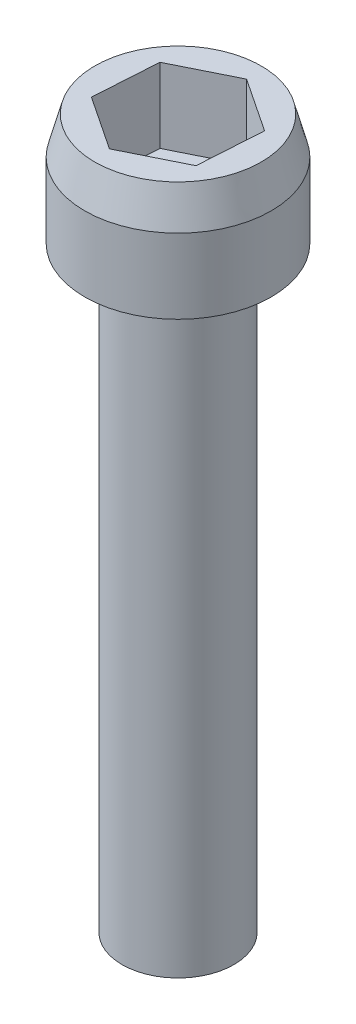
ISO-10303-21;
HEADER;
FILE_DESCRIPTION(('STEP AP214'),'2;1');
FILE_NAME('part.step','',(''),(''),'','','');
FILE_SCHEMA(('AUTOMOTIVE_DESIGN { 1 0 10303 214 1 1 1 1 }'));
ENDSEC;
DATA;
#1=APPLICATION_CONTEXT('core data for automotive mechanical design processes');
#2=APPLICATION_PROTOCOL_DEFINITION('international standard','automotive_design',2000,#1);
#3=PRODUCT_CONTEXT('',#1,'mechanical');
#4=PRODUCT('Part','Part','',(#3));
#5=PRODUCT_RELATED_PRODUCT_CATEGORY('part','',(#4));
#6=PRODUCT_DEFINITION_FORMATION('','',#4);
#7=PRODUCT_DEFINITION_CONTEXT('part definition',#1,'design');
#8=PRODUCT_DEFINITION('design','',#6,#7);
#9=PRODUCT_DEFINITION_SHAPE('','',#8);
#10=(LENGTH_UNIT() NAMED_UNIT(*) SI_UNIT(.MILLI.,.METRE.));
#11=(NAMED_UNIT(*) PLANE_ANGLE_UNIT() SI_UNIT($,.RADIAN.));
#12=(NAMED_UNIT(*) SI_UNIT($,.STERADIAN.) SOLID_ANGLE_UNIT());
#13=UNCERTAINTY_MEASURE_WITH_UNIT(LENGTH_MEASURE(1.E-05),#10,'distance_accuracy_value','');
#14=(GEOMETRIC_REPRESENTATION_CONTEXT(3) GLOBAL_UNCERTAINTY_ASSIGNED_CONTEXT((#13)) GLOBAL_UNIT_ASSIGNED_CONTEXT((#10,
#11,#12)) REPRESENTATION_CONTEXT('',''));
#15=CARTESIAN_POINT('',(0.,0.,0.));
#16=DIRECTION('',(0.,0.,1.));
#17=DIRECTION('',(1.,0.,0.));
#18=AXIS2_PLACEMENT_3D('',#15,#16,#17);
#19=CARTESIAN_POINT('',(0.,16.,0.));
#20=DIRECTION('',(0.,-1.,0.));
#21=DIRECTION('',(0.,0.,-1.));
#22=AXIS2_PLACEMENT_3D('',#19,#20,#21);
#23=CYLINDRICAL_SURFACE('',#22,1.5);
#24=CARTESIAN_POINT('',(0.,16.,0.));
#25=DIRECTION('',(0.,1.,0.));
#26=DIRECTION('',(0.,0.,1.));
#27=AXIS2_PLACEMENT_3D('',#24,#25,#26);
#28=CIRCLE('',#27,1.5);
#29=CARTESIAN_POINT('',(0.,16.,1.5));
#30=VERTEX_POINT('',#29);
#31=EDGE_CURVE('E143',#30,#30,#28,.T.);
#32=ORIENTED_EDGE('',*,*,#31,.F.);
#33=EDGE_LOOP('',(#32));
#34=FACE_BOUND('',#33,.T.);
#35=CARTESIAN_POINT('',(0.,0.,0.));
#36=DIRECTION('',(0.,1.,0.));
#37=DIRECTION('',(0.,0.,1.));
#38=AXIS2_PLACEMENT_3D('',#35,#36,#37);
#39=CIRCLE('',#38,1.5);
#40=CARTESIAN_POINT('',(0.,0.,1.5));
#41=VERTEX_POINT('',#40);
#42=EDGE_CURVE('E142',#41,#41,#39,.T.);
#43=ORIENTED_EDGE('',*,*,#42,.T.);
#44=EDGE_LOOP('',(#43));
#45=FACE_BOUND('',#44,.T.);
#46=ADVANCED_FACE('F32',(#34,#45),#23,.T.);
#47=CARTESIAN_POINT('',(0.,0.,0.));
#48=DIRECTION('',(0.,1.,0.));
#49=DIRECTION('',(0.,0.,1.));
#50=AXIS2_PLACEMENT_3D('',#47,#48,#49);
#51=PLANE('',#50);
#52=ORIENTED_EDGE('',*,*,#42,.F.);
#53=EDGE_LOOP('',(#52));
#54=FACE_BOUND('',#53,.T.);
#55=ADVANCED_FACE('F166',(#54),#51,.F.);
#56=CARTESIAN_POINT('',(0.,19.,0.));
#57=DIRECTION('',(0.,-1.,0.));
#58=DIRECTION('',(0.,0.,-1.));
#59=AXIS2_PLACEMENT_3D('',#56,#57,#58);
#60=CYLINDRICAL_SURFACE('',#59,2.5);
#61=CARTESIAN_POINT('',(0.,18.,0.));
#62=DIRECTION('',(0.,1.,0.));
#63=DIRECTION('',(0.,0.,1.));
#64=AXIS2_PLACEMENT_3D('',#61,#62,#63);
#65=CIRCLE('',#64,2.5);
#66=CARTESIAN_POINT('',(0.,18.,2.5));
#67=VERTEX_POINT('',#66);
#68=EDGE_CURVE('E11',#67,#67,#65,.F.);
#69=ORIENTED_EDGE('',*,*,#68,.T.);
#70=EDGE_LOOP('',(#69));
#71=FACE_BOUND('',#70,.T.);
#72=CARTESIAN_POINT('',(0.,16.,0.));
#73=DIRECTION('',(0.,1.,0.));
#74=DIRECTION('',(0.,0.,1.));
#75=AXIS2_PLACEMENT_3D('',#72,#73,#74);
#76=CIRCLE('',#75,2.5);
#77=CARTESIAN_POINT('',(0.,16.,2.5));
#78=VERTEX_POINT('',#77);
#79=EDGE_CURVE('E134',#78,#78,#76,.T.);
#80=ORIENTED_EDGE('',*,*,#79,.T.);
#81=EDGE_LOOP('',(#80));
#82=FACE_BOUND('',#81,.T.);
#83=ADVANCED_FACE('F171',(#71,#82),#60,.T.);
#84=CARTESIAN_POINT('',(0.,19.,0.));
#85=DIRECTION('',(0.,1.,0.));
#86=DIRECTION('',(0.,0.,1.));
#87=AXIS2_PLACEMENT_3D('',#84,#85,#86);
#88=PLANE('',#87);
#89=DIRECTION('',(0.832703024044809,0.,0.55371985132071));
#90=VECTOR('',#89,1.);
#91=CARTESIAN_POINT('',(-1.55172174961199,19.,0.769519078243736));
#92=LINE('',#91,#90);
#93=CARTESIAN_POINT('',(-1.55172174961199,19.,0.769519078243736));
#94=VERTEX_POINT('',#93);
#95=CARTESIAN_POINT('',(-0.109437804350137,19.,1.72858999389069));
#96=VERTEX_POINT('',#95);
#97=EDGE_CURVE('E47',#94,#96,#92,.T.);
#98=ORIENTED_EDGE('',*,*,#97,.F.);
#99=DIRECTION('',(-0.0631839458010727,0.,0.998001898291284));
#100=VECTOR('',#99,1.);
#101=CARTESIAN_POINT('',(-1.44228394526186,19.,-0.959070915646955));
#102=LINE('',#101,#100);
#103=CARTESIAN_POINT('',(-1.44228394526186,19.,-0.959070915646955));
#104=VERTEX_POINT('',#103);
#105=EDGE_CURVE('E130',#104,#94,#102,.T.);
#106=ORIENTED_EDGE('',*,*,#105,.F.);
#107=DIRECTION('',(-0.895886969845882,0.,0.444282046970574));
#108=VECTOR('',#107,1.);
#109=CARTESIAN_POINT('',(0.109437804350136,19.,-1.72858999389069));
#110=LINE('',#109,#108);
#111=CARTESIAN_POINT('',(0.109437804350136,19.,-1.72858999389069));
#112=VERTEX_POINT('',#111);
#113=EDGE_CURVE('E128',#112,#104,#110,.T.);
#114=ORIENTED_EDGE('',*,*,#113,.F.);
#115=DIRECTION('',(-0.83270302404481,0.,-0.55371985132071));
#116=VECTOR('',#115,1.);
#117=CARTESIAN_POINT('',(1.55172174961199,19.,-0.769519078243738));
#118=LINE('',#117,#116);
#119=CARTESIAN_POINT('',(1.55172174961199,19.,-0.769519078243738));
#120=VERTEX_POINT('',#119);
#121=EDGE_CURVE('E95',#120,#112,#118,.T.);
#122=ORIENTED_EDGE('',*,*,#121,.F.);
#123=DIRECTION('',(0.0631839458010727,0.,-0.998001898291284));
#124=VECTOR('',#123,1.);
#125=CARTESIAN_POINT('',(1.44228394526186,19.,0.959070915646955));
#126=LINE('',#125,#124);
#127=CARTESIAN_POINT('',(1.44228394526186,19.,0.959070915646955));
#128=VERTEX_POINT('',#127);
#129=EDGE_CURVE('E124',#128,#120,#126,.T.);
#130=ORIENTED_EDGE('',*,*,#129,.F.);
#131=DIRECTION('',(0.895886969845882,0.,-0.444282046970574));
#132=VECTOR('',#131,1.);
#133=CARTESIAN_POINT('',(-0.109437804350136,19.,1.72858999389069));
#134=LINE('',#133,#132);
#135=EDGE_CURVE('E121',#96,#128,#134,.T.);
#136=ORIENTED_EDGE('',*,*,#135,.F.);
#137=EDGE_LOOP('',(#98,#106,#114,#122,#130,#136));
#138=FACE_BOUND('',#137,.T.);
#139=CARTESIAN_POINT('',(0.,19.,0.));
#140=DIRECTION('',(0.,1.,0.));
#141=DIRECTION('',(0.,0.,1.));
#142=AXIS2_PLACEMENT_3D('',#139,#140,#141);
#143=CIRCLE('',#142,2.23205080756887);
#144=CARTESIAN_POINT('',(0.,19.,2.23205080756887));
#145=VERTEX_POINT('',#144);
#146=EDGE_CURVE('E40',#145,#145,#143,.T.);
#147=ORIENTED_EDGE('',*,*,#146,.T.);
#148=EDGE_LOOP('',(#147));
#149=FACE_BOUND('',#148,.T.);
#150=ADVANCED_FACE('F150',(#138,#149),#88,.T.);
#151=CARTESIAN_POINT('',(0.,16.,0.));
#152=DIRECTION('',(0.,1.,0.));
#153=DIRECTION('',(0.,0.,1.));
#154=AXIS2_PLACEMENT_3D('',#151,#152,#153);
#155=PLANE('',#154);
#156=ORIENTED_EDGE('',*,*,#31,.T.);
#157=EDGE_LOOP('',(#156));
#158=FACE_BOUND('',#157,.T.);
#159=ORIENTED_EDGE('',*,*,#79,.F.);
#160=EDGE_LOOP('',(#159));
#161=FACE_BOUND('',#160,.T.);
#162=ADVANCED_FACE('F154',(#158,#161),#155,.F.);
#163=CARTESIAN_POINT('',(0.,19.,0.));
#164=DIRECTION('',(0.,-1.,0.));
#165=DIRECTION('',(0.,0.,-1.));
#166=AXIS2_PLACEMENT_3D('',#163,#164,#165);
#167=CONICAL_SURFACE('',#166,2.23205080756887,0.261799387799149);
#168=ORIENTED_EDGE('',*,*,#68,.F.);
#169=EDGE_LOOP('',(#168));
#170=FACE_BOUND('',#169,.T.);
#171=ORIENTED_EDGE('',*,*,#146,.F.);
#172=EDGE_LOOP('',(#171));
#173=FACE_BOUND('',#172,.T.);
#174=ADVANCED_FACE('F34',(#170,#173),#167,.T.);
#175=CARTESIAN_POINT('',(-1.55172174961199,17.,0.769519078243736));
#176=DIRECTION('',(-0.55371985132071,0.,0.832703024044809));
#177=DIRECTION('',(0.832703024044809,0.,0.55371985132071));
#178=AXIS2_PLACEMENT_3D('',#175,#176,#177);
#179=PLANE('',#178);
#180=ORIENTED_EDGE('',*,*,#97,.T.);
#181=DIRECTION('',(0.,1.,0.));
#182=VECTOR('',#181,1.);
#183=CARTESIAN_POINT('',(-0.109437804350136,17.,1.72858999389069));
#184=LINE('',#183,#182);
#185=CARTESIAN_POINT('',(-0.109437804350136,17.,1.72858999389069));
#186=VERTEX_POINT('',#185);
#187=EDGE_CURVE('E77',#186,#96,#184,.T.);
#188=ORIENTED_EDGE('',*,*,#187,.F.);
#189=DIRECTION('',(0.832703024044809,0.,0.55371985132071));
#190=VECTOR('',#189,1.);
#191=CARTESIAN_POINT('',(-1.55172174961199,17.,0.769519078243736));
#192=LINE('',#191,#190);
#193=CARTESIAN_POINT('',(-1.55172174961199,17.,0.769519078243736));
#194=VERTEX_POINT('',#193);
#195=EDGE_CURVE('E132',#194,#186,#192,.T.);
#196=ORIENTED_EDGE('',*,*,#195,.F.);
#197=DIRECTION('',(0.,1.,0.));
#198=VECTOR('',#197,1.);
#199=CARTESIAN_POINT('',(-1.55172174961199,17.,0.769519078243736));
#200=LINE('',#199,#198);
#201=EDGE_CURVE('E55',#194,#94,#200,.T.);
#202=ORIENTED_EDGE('',*,*,#201,.T.);
#203=EDGE_LOOP('',(#180,#188,#196,#202));
#204=FACE_BOUND('',#203,.T.);
#205=ADVANCED_FACE('F153',(#204),#179,.F.);
#206=CARTESIAN_POINT('',(-1.44228394526186,17.,-0.959070915646955));
#207=DIRECTION('',(-0.998001898291284,0.,-0.0631839458010727));
#208=DIRECTION('',(-0.0631839458010727,0.,0.998001898291284));
#209=AXIS2_PLACEMENT_3D('',#206,#207,#208);
#210=PLANE('',#209);
#211=ORIENTED_EDGE('',*,*,#105,.T.);
#212=ORIENTED_EDGE('',*,*,#201,.F.);
#213=DIRECTION('',(-0.0631839458010727,0.,0.998001898291284));
#214=VECTOR('',#213,1.);
#215=CARTESIAN_POINT('',(-1.44228394526186,17.,-0.959070915646955));
#216=LINE('',#215,#214);
#217=CARTESIAN_POINT('',(-1.44228394526186,17.,-0.959070915646955));
#218=VERTEX_POINT('',#217);
#219=EDGE_CURVE('E107',#218,#194,#216,.T.);
#220=ORIENTED_EDGE('',*,*,#219,.F.);
#221=DIRECTION('',(0.,1.,0.));
#222=VECTOR('',#221,1.);
#223=CARTESIAN_POINT('',(-1.44228394526186,17.,-0.959070915646955));
#224=LINE('',#223,#222);
#225=EDGE_CURVE('E99',#218,#104,#224,.T.);
#226=ORIENTED_EDGE('',*,*,#225,.T.);
#227=EDGE_LOOP('',(#211,#212,#220,#226));
#228=FACE_BOUND('',#227,.T.);
#229=ADVANCED_FACE('F160',(#228),#210,.F.);
#230=CARTESIAN_POINT('',(0.109437804350136,17.,-1.72858999389069));
#231=DIRECTION('',(-0.444282046970574,0.,-0.895886969845882));
#232=DIRECTION('',(-0.895886969845882,0.,0.444282046970574));
#233=AXIS2_PLACEMENT_3D('',#230,#231,#232);
#234=PLANE('',#233);
#235=ORIENTED_EDGE('',*,*,#113,.T.);
#236=ORIENTED_EDGE('',*,*,#225,.F.);
#237=DIRECTION('',(-0.895886969845882,0.,0.444282046970574));
#238=VECTOR('',#237,1.);
#239=CARTESIAN_POINT('',(0.109437804350136,17.,-1.72858999389069));
#240=LINE('',#239,#238);
#241=CARTESIAN_POINT('',(0.109437804350136,17.,-1.72858999389069));
#242=VERTEX_POINT('',#241);
#243=EDGE_CURVE('E103',#242,#218,#240,.T.);
#244=ORIENTED_EDGE('',*,*,#243,.F.);
#245=DIRECTION('',(0.,1.,0.));
#246=VECTOR('',#245,1.);
#247=CARTESIAN_POINT('',(0.109437804350136,17.,-1.72858999389069));
#248=LINE('',#247,#246);
#249=EDGE_CURVE('E88',#242,#112,#248,.T.);
#250=ORIENTED_EDGE('',*,*,#249,.T.);
#251=EDGE_LOOP('',(#235,#236,#244,#250));
#252=FACE_BOUND('',#251,.T.);
#253=ADVANCED_FACE('F104',(#252),#234,.F.);
#254=CARTESIAN_POINT('',(1.55172174961199,17.,-0.769519078243738));
#255=DIRECTION('',(0.55371985132071,0.,-0.83270302404481));
#256=DIRECTION('',(-0.83270302404481,0.,-0.55371985132071));
#257=AXIS2_PLACEMENT_3D('',#254,#255,#256);
#258=PLANE('',#257);
#259=ORIENTED_EDGE('',*,*,#121,.T.);
#260=ORIENTED_EDGE('',*,*,#249,.F.);
#261=DIRECTION('',(-0.83270302404481,0.,-0.55371985132071));
#262=VECTOR('',#261,1.);
#263=CARTESIAN_POINT('',(1.55172174961199,17.,-0.769519078243738));
#264=LINE('',#263,#262);
#265=CARTESIAN_POINT('',(1.55172174961199,17.,-0.769519078243738));
#266=VERTEX_POINT('',#265);
#267=EDGE_CURVE('E92',#266,#242,#264,.T.);
#268=ORIENTED_EDGE('',*,*,#267,.F.);
#269=DIRECTION('',(0.,1.,0.));
#270=VECTOR('',#269,1.);
#271=CARTESIAN_POINT('',(1.55172174961199,17.,-0.769519078243738));
#272=LINE('',#271,#270);
#273=EDGE_CURVE('E100',#266,#120,#272,.T.);
#274=ORIENTED_EDGE('',*,*,#273,.T.);
#275=EDGE_LOOP('',(#259,#260,#268,#274));
#276=FACE_BOUND('',#275,.T.);
#277=ADVANCED_FACE('F90',(#276),#258,.F.);
#278=CARTESIAN_POINT('',(1.44228394526186,17.,0.959070915646955));
#279=DIRECTION('',(0.998001898291285,0.,0.0631839458010727));
#280=DIRECTION('',(0.0631839458010727,0.,-0.998001898291284));
#281=AXIS2_PLACEMENT_3D('',#278,#279,#280);
#282=PLANE('',#281);
#283=ORIENTED_EDGE('',*,*,#129,.T.);
#284=ORIENTED_EDGE('',*,*,#273,.F.);
#285=DIRECTION('',(0.0631839458010727,0.,-0.998001898291284));
#286=VECTOR('',#285,1.);
#287=CARTESIAN_POINT('',(1.44228394526186,17.,0.959070915646955));
#288=LINE('',#287,#286);
#289=CARTESIAN_POINT('',(1.44228394526186,17.,0.959070915646955));
#290=VERTEX_POINT('',#289);
#291=EDGE_CURVE('E113',#290,#266,#288,.T.);
#292=ORIENTED_EDGE('',*,*,#291,.F.);
#293=DIRECTION('',(0.,1.,0.));
#294=VECTOR('',#293,1.);
#295=CARTESIAN_POINT('',(1.44228394526186,17.,0.959070915646955));
#296=LINE('',#295,#294);
#297=EDGE_CURVE('E137',#290,#128,#296,.T.);
#298=ORIENTED_EDGE('',*,*,#297,.T.);
#299=EDGE_LOOP('',(#283,#284,#292,#298));
#300=FACE_BOUND('',#299,.T.);
#301=ADVANCED_FACE('F186',(#300),#282,.F.);
#302=CARTESIAN_POINT('',(-0.109437804350136,17.,1.72858999389069));
#303=DIRECTION('',(0.444282046970574,0.,0.895886969845882));
#304=DIRECTION('',(0.895886969845882,0.,-0.444282046970574));
#305=AXIS2_PLACEMENT_3D('',#302,#303,#304);
#306=PLANE('',#305);
#307=ORIENTED_EDGE('',*,*,#135,.T.);
#308=ORIENTED_EDGE('',*,*,#297,.F.);
#309=DIRECTION('',(0.895886969845882,0.,-0.444282046970574));
#310=VECTOR('',#309,1.);
#311=CARTESIAN_POINT('',(-0.109437804350136,17.,1.72858999389069));
#312=LINE('',#311,#310);
#313=EDGE_CURVE('E115',#186,#290,#312,.T.);
#314=ORIENTED_EDGE('',*,*,#313,.F.);
#315=ORIENTED_EDGE('',*,*,#187,.T.);
#316=EDGE_LOOP('',(#307,#308,#314,#315));
#317=FACE_BOUND('',#316,.T.);
#318=ADVANCED_FACE('F183',(#317),#306,.F.);
#319=CARTESIAN_POINT('',(0.,17.,0.));
#320=DIRECTION('',(0.,1.,0.));
#321=DIRECTION('',(0.,0.,1.));
#322=AXIS2_PLACEMENT_3D('',#319,#320,#321);
#323=PLANE('',#322);
#324=ORIENTED_EDGE('',*,*,#195,.T.);
#325=ORIENTED_EDGE('',*,*,#313,.T.);
#326=ORIENTED_EDGE('',*,*,#291,.T.);
#327=ORIENTED_EDGE('',*,*,#267,.T.);
#328=ORIENTED_EDGE('',*,*,#243,.T.);
#329=ORIENTED_EDGE('',*,*,#219,.T.);
#330=EDGE_LOOP('',(#324,#325,#326,#327,#328,#329));
#331=FACE_BOUND('',#330,.T.);
#332=ADVANCED_FACE('F110',(#331),#323,.T.);
#333=CLOSED_SHELL('',(#46,#55,#83,#150,#162,#174,#205,#229,#253,#277,#301,#318,#332));
#334=MANIFOLD_SOLID_BREP('B2',#333);
#335=ADVANCED_BREP_SHAPE_REPRESENTATION('',(#18,#334),#14);
#336=SHAPE_DEFINITION_REPRESENTATION(#9,#335);
ENDSEC;
END-ISO-10303-21;
